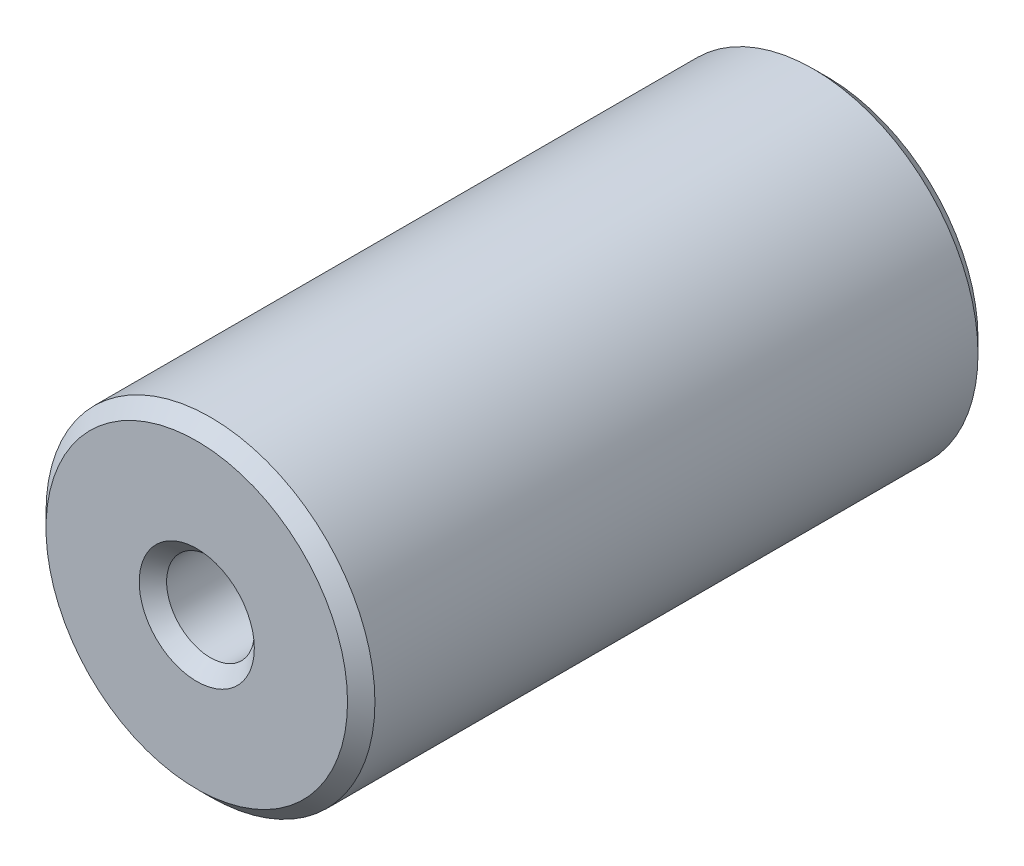
ISO-10303-21;
HEADER;
FILE_DESCRIPTION(('STEP AP214'),'2;1');
FILE_NAME('part.step','',(''),(''),'','','');
FILE_SCHEMA(('AUTOMOTIVE_DESIGN { 1 0 10303 214 1 1 1 1 }'));
ENDSEC;
DATA;
#1=APPLICATION_CONTEXT('core data for automotive mechanical design processes');
#2=APPLICATION_PROTOCOL_DEFINITION('international standard','automotive_design',2000,#1);
#3=PRODUCT_CONTEXT('',#1,'mechanical');
#4=PRODUCT('Part','Part','',(#3));
#5=PRODUCT_RELATED_PRODUCT_CATEGORY('part','',(#4));
#6=PRODUCT_DEFINITION_FORMATION('','',#4);
#7=PRODUCT_DEFINITION_CONTEXT('part definition',#1,'design');
#8=PRODUCT_DEFINITION('design','',#6,#7);
#9=PRODUCT_DEFINITION_SHAPE('','',#8);
#10=(LENGTH_UNIT() NAMED_UNIT(*) SI_UNIT(.MILLI.,.METRE.));
#11=(NAMED_UNIT(*) PLANE_ANGLE_UNIT() SI_UNIT($,.RADIAN.));
#12=(NAMED_UNIT(*) SI_UNIT($,.STERADIAN.) SOLID_ANGLE_UNIT());
#13=UNCERTAINTY_MEASURE_WITH_UNIT(LENGTH_MEASURE(1.E-05),#10,'distance_accuracy_value','');
#14=(GEOMETRIC_REPRESENTATION_CONTEXT(3) GLOBAL_UNCERTAINTY_ASSIGNED_CONTEXT((#13)) GLOBAL_UNIT_ASSIGNED_CONTEXT((#10,
#11,#12)) REPRESENTATION_CONTEXT('',''));
#15=CARTESIAN_POINT('',(0.,0.,0.));
#16=DIRECTION('',(0.,0.,1.));
#17=DIRECTION('',(1.,0.,0.));
#18=AXIS2_PLACEMENT_3D('',#15,#16,#17);
#19=CARTESIAN_POINT('',(0.,0.,46.));
#20=DIRECTION('',(0.,0.,1.));
#21=DIRECTION('',(1.,0.,0.));
#22=AXIS2_PLACEMENT_3D('',#19,#20,#21);
#23=PLANE('',#22);
#24=CARTESIAN_POINT('',(0.,0.,46.));
#25=DIRECTION('',(0.,0.,1.));
#26=DIRECTION('',(1.,0.,0.));
#27=AXIS2_PLACEMENT_3D('',#24,#25,#26);
#28=CIRCLE('',#27,4.20000000000002);
#29=CARTESIAN_POINT('',(4.20000000000002,0.,46.));
#30=VERTEX_POINT('',#29);
#31=EDGE_CURVE('E42',#30,#30,#28,.F.);
#32=ORIENTED_EDGE('',*,*,#31,.T.);
#33=EDGE_LOOP('',(#32));
#34=FACE_BOUND('',#33,.T.);
#35=CARTESIAN_POINT('',(0.,0.,46.));
#36=DIRECTION('',(0.,0.,1.));
#37=DIRECTION('',(1.,0.,0.));
#38=AXIS2_PLACEMENT_3D('',#35,#36,#37);
#39=CIRCLE('',#38,11.);
#40=CARTESIAN_POINT('',(11.,0.,46.));
#41=VERTEX_POINT('',#40);
#42=EDGE_CURVE('E46',#41,#41,#39,.T.);
#43=ORIENTED_EDGE('',*,*,#42,.T.);
#44=EDGE_LOOP('',(#43));
#45=FACE_BOUND('',#44,.T.);
#46=ADVANCED_FACE('F31',(#34,#45),#23,.T.);
#47=CARTESIAN_POINT('',(0.,0.,0.));
#48=DIRECTION('',(0.,0.,1.));
#49=DIRECTION('',(1.,0.,0.));
#50=AXIS2_PLACEMENT_3D('',#47,#48,#49);
#51=PLANE('',#50);
#52=CARTESIAN_POINT('',(0.,0.,0.));
#53=DIRECTION('',(0.,0.,1.));
#54=DIRECTION('',(1.,0.,0.));
#55=AXIS2_PLACEMENT_3D('',#52,#53,#54);
#56=CIRCLE('',#55,4.2);
#57=CARTESIAN_POINT('',(4.2,0.,0.));
#58=VERTEX_POINT('',#57);
#59=EDGE_CURVE('E57',#58,#58,#56,.T.);
#60=ORIENTED_EDGE('',*,*,#59,.T.);
#61=EDGE_LOOP('',(#60));
#62=FACE_BOUND('',#61,.T.);
#63=CARTESIAN_POINT('',(0.,0.,0.));
#64=DIRECTION('',(0.,0.,1.));
#65=DIRECTION('',(1.,0.,0.));
#66=AXIS2_PLACEMENT_3D('',#63,#64,#65);
#67=CIRCLE('',#66,11.);
#68=CARTESIAN_POINT('',(11.,0.,0.));
#69=VERTEX_POINT('',#68);
#70=EDGE_CURVE('E60',#69,#69,#67,.F.);
#71=ORIENTED_EDGE('',*,*,#70,.T.);
#72=EDGE_LOOP('',(#71));
#73=FACE_BOUND('',#72,.T.);
#74=ADVANCED_FACE('F64',(#62,#73),#51,.F.);
#75=CARTESIAN_POINT('',(0.,0.,46.));
#76=DIRECTION('',(0.,0.,-1.));
#77=DIRECTION('',(-1.,0.,0.));
#78=AXIS2_PLACEMENT_3D('',#75,#76,#77);
#79=CYLINDRICAL_SURFACE('',#78,12.);
#80=CARTESIAN_POINT('',(0.,0.,1.00000000000001));
#81=DIRECTION('',(0.,0.,1.));
#82=DIRECTION('',(1.,0.,0.));
#83=AXIS2_PLACEMENT_3D('',#80,#81,#82);
#84=CIRCLE('',#83,12.);
#85=CARTESIAN_POINT('',(12.,0.,1.00000000000001));
#86=VERTEX_POINT('',#85);
#87=EDGE_CURVE('E10',#86,#86,#84,.T.);
#88=ORIENTED_EDGE('',*,*,#87,.T.);
#89=EDGE_LOOP('',(#88));
#90=FACE_BOUND('',#89,.T.);
#91=CARTESIAN_POINT('',(0.,0.,45.));
#92=DIRECTION('',(0.,0.,1.));
#93=DIRECTION('',(1.,0.,0.));
#94=AXIS2_PLACEMENT_3D('',#91,#92,#93);
#95=CIRCLE('',#94,12.);
#96=CARTESIAN_POINT('',(12.,0.,45.));
#97=VERTEX_POINT('',#96);
#98=EDGE_CURVE('E38',#97,#97,#95,.F.);
#99=ORIENTED_EDGE('',*,*,#98,.T.);
#100=EDGE_LOOP('',(#99));
#101=FACE_BOUND('',#100,.T.);
#102=ADVANCED_FACE('F84',(#90,#101),#79,.T.);
#103=CARTESIAN_POINT('',(0.,0.,46.));
#104=DIRECTION('',(0.,0.,-1.));
#105=DIRECTION('',(-1.,0.,0.));
#106=AXIS2_PLACEMENT_3D('',#103,#104,#105);
#107=CYLINDRICAL_SURFACE('',#106,3.2);
#108=CARTESIAN_POINT('',(0.,0.,1.));
#109=DIRECTION('',(0.,0.,1.));
#110=DIRECTION('',(1.,0.,0.));
#111=AXIS2_PLACEMENT_3D('',#108,#109,#110);
#112=CIRCLE('',#111,3.2);
#113=CARTESIAN_POINT('',(3.2,0.,1.));
#114=VERTEX_POINT('',#113);
#115=EDGE_CURVE('E51',#114,#114,#112,.F.);
#116=ORIENTED_EDGE('',*,*,#115,.T.);
#117=EDGE_LOOP('',(#116));
#118=FACE_BOUND('',#117,.T.);
#119=CARTESIAN_POINT('',(0.,0.,45.));
#120=DIRECTION('',(0.,0.,1.));
#121=DIRECTION('',(1.,0.,0.));
#122=AXIS2_PLACEMENT_3D('',#119,#120,#121);
#123=CIRCLE('',#122,3.2);
#124=CARTESIAN_POINT('',(3.2,0.,45.));
#125=VERTEX_POINT('',#124);
#126=EDGE_CURVE('E54',#125,#125,#123,.T.);
#127=ORIENTED_EDGE('',*,*,#126,.T.);
#128=EDGE_LOOP('',(#127));
#129=FACE_BOUND('',#128,.T.);
#130=ADVANCED_FACE('F89',(#118,#129),#107,.F.);
#131=CARTESIAN_POINT('',(0.,0.,0.));
#132=DIRECTION('',(0.,0.,-1.));
#133=DIRECTION('',(-1.,0.,0.));
#134=AXIS2_PLACEMENT_3D('',#131,#132,#133);
#135=CONICAL_SURFACE('',#134,4.2,0.785398163397446);
#136=ORIENTED_EDGE('',*,*,#115,.F.);
#137=EDGE_LOOP('',(#136));
#138=FACE_BOUND('',#137,.T.);
#139=ORIENTED_EDGE('',*,*,#59,.F.);
#140=EDGE_LOOP('',(#139));
#141=FACE_BOUND('',#140,.T.);
#142=ADVANCED_FACE('F75',(#138,#141),#135,.F.);
#143=CARTESIAN_POINT('',(0.,0.,45.));
#144=DIRECTION('',(0.,0.,1.));
#145=DIRECTION('',(1.,0.,0.));
#146=AXIS2_PLACEMENT_3D('',#143,#144,#145);
#147=CONICAL_SURFACE('',#146,3.2,0.785398163397456);
#148=ORIENTED_EDGE('',*,*,#31,.F.);
#149=EDGE_LOOP('',(#148));
#150=FACE_BOUND('',#149,.T.);
#151=ORIENTED_EDGE('',*,*,#126,.F.);
#152=EDGE_LOOP('',(#151));
#153=FACE_BOUND('',#152,.T.);
#154=ADVANCED_FACE('F69',(#150,#153),#147,.F.);
#155=CARTESIAN_POINT('',(0.,0.,1.00000000000001));
#156=DIRECTION('',(0.,0.,1.));
#157=DIRECTION('',(1.,0.,0.));
#158=AXIS2_PLACEMENT_3D('',#155,#156,#157);
#159=CONICAL_SURFACE('',#158,12.,0.785398163397448);
#160=ORIENTED_EDGE('',*,*,#70,.F.);
#161=EDGE_LOOP('',(#160));
#162=FACE_BOUND('',#161,.T.);
#163=ORIENTED_EDGE('',*,*,#87,.F.);
#164=EDGE_LOOP('',(#163));
#165=FACE_BOUND('',#164,.T.);
#166=ADVANCED_FACE('F66',(#162,#165),#159,.T.);
#167=CARTESIAN_POINT('',(0.,0.,46.));
#168=DIRECTION('',(0.,0.,-1.));
#169=DIRECTION('',(-1.,0.,0.));
#170=AXIS2_PLACEMENT_3D('',#167,#168,#169);
#171=CONICAL_SURFACE('',#170,11.,0.785398163397447);
#172=ORIENTED_EDGE('',*,*,#98,.F.);
#173=EDGE_LOOP('',(#172));
#174=FACE_BOUND('',#173,.T.);
#175=ORIENTED_EDGE('',*,*,#42,.F.);
#176=EDGE_LOOP('',(#175));
#177=FACE_BOUND('',#176,.T.);
#178=ADVANCED_FACE('F33',(#174,#177),#171,.T.);
#179=CLOSED_SHELL('',(#46,#74,#102,#130,#142,#154,#166,#178));
#180=MANIFOLD_SOLID_BREP('B2',#179);
#181=ADVANCED_BREP_SHAPE_REPRESENTATION('',(#18,#180),#14);
#182=SHAPE_DEFINITION_REPRESENTATION(#9,#181);
ENDSEC;
END-ISO-10303-21;
